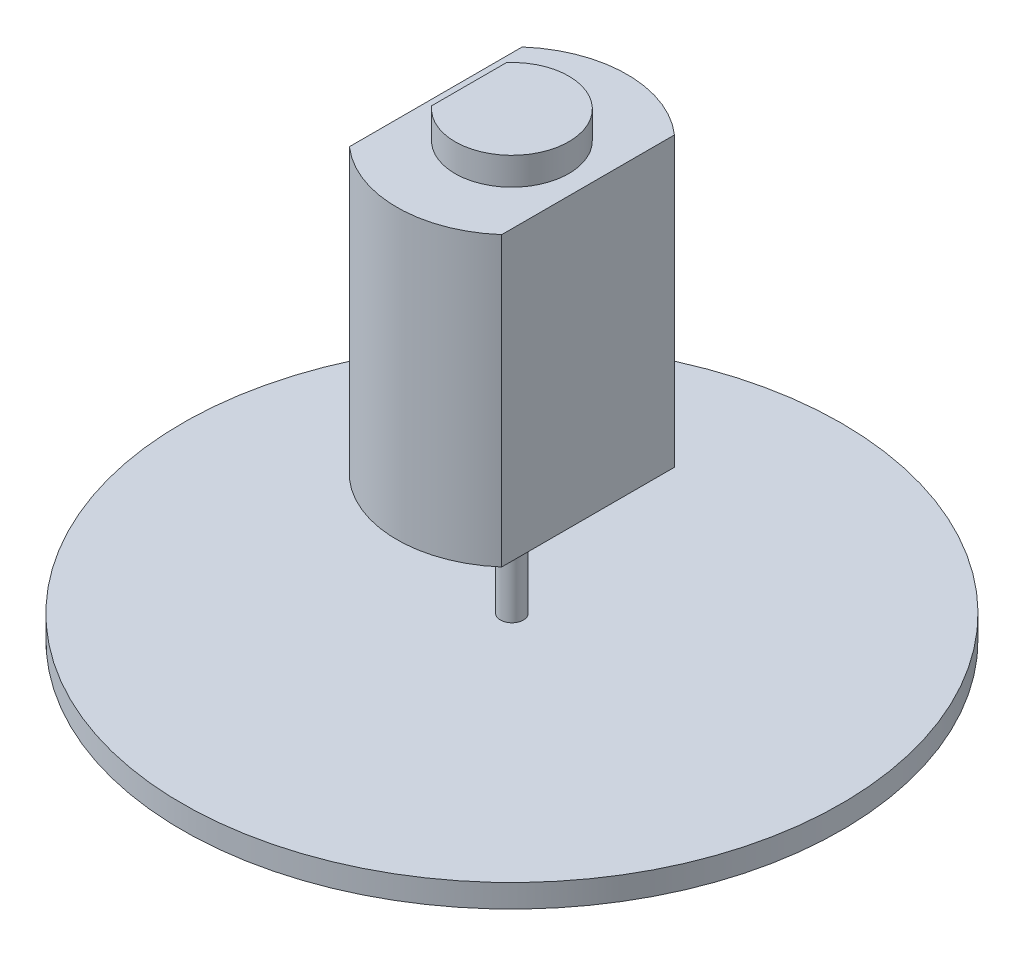
ISO-10303-21;
HEADER;
FILE_DESCRIPTION(('STEP AP214'),'2;1');
FILE_NAME('part.step','',(''),(''),'','','');
FILE_SCHEMA(('AUTOMOTIVE_DESIGN { 1 0 10303 214 1 1 1 1 }'));
ENDSEC;
DATA;
#1=APPLICATION_CONTEXT('core data for automotive mechanical design processes');
#2=APPLICATION_PROTOCOL_DEFINITION('international standard','automotive_design',2000,#1);
#3=PRODUCT_CONTEXT('',#1,'mechanical');
#4=PRODUCT('Part','Part','',(#3));
#5=PRODUCT_RELATED_PRODUCT_CATEGORY('part','',(#4));
#6=PRODUCT_DEFINITION_FORMATION('','',#4);
#7=PRODUCT_DEFINITION_CONTEXT('part definition',#1,'design');
#8=PRODUCT_DEFINITION('design','',#6,#7);
#9=PRODUCT_DEFINITION_SHAPE('','',#8);
#10=(LENGTH_UNIT() NAMED_UNIT(*) SI_UNIT(.MILLI.,.METRE.));
#11=(NAMED_UNIT(*) PLANE_ANGLE_UNIT() SI_UNIT($,.RADIAN.));
#12=(NAMED_UNIT(*) SI_UNIT($,.STERADIAN.) SOLID_ANGLE_UNIT());
#13=UNCERTAINTY_MEASURE_WITH_UNIT(LENGTH_MEASURE(1.E-05),#10,'distance_accuracy_value','');
#14=(GEOMETRIC_REPRESENTATION_CONTEXT(3) GLOBAL_UNCERTAINTY_ASSIGNED_CONTEXT((#13)) GLOBAL_UNIT_ASSIGNED_CONTEXT((#10,
#11,#12)) REPRESENTATION_CONTEXT('',''));
#15=CARTESIAN_POINT('',(0.,0.,0.));
#16=DIRECTION('',(0.,0.,1.));
#17=DIRECTION('',(1.,0.,0.));
#18=AXIS2_PLACEMENT_3D('',#15,#16,#17);
#19=CARTESIAN_POINT('',(0.,25.,0.));
#20=DIRECTION('',(0.,-1.,0.));
#21=DIRECTION('',(0.,0.,-1.));
#22=AXIS2_PLACEMENT_3D('',#19,#20,#21);
#23=CYLINDRICAL_SURFACE('',#22,10.);
#24=CARTESIAN_POINT('',(0.,0.,0.));
#25=DIRECTION('',(0.,1.,0.));
#26=DIRECTION('',(0.,0.,1.));
#27=AXIS2_PLACEMENT_3D('',#24,#25,#26);
#28=CIRCLE('',#27,10.);
#29=CARTESIAN_POINT('',(6.61437827766148,0.,-7.5));
#30=VERTEX_POINT('',#29);
#31=CARTESIAN_POINT('',(-6.61437827766148,0.,-7.5));
#32=VERTEX_POINT('',#31);
#33=EDGE_CURVE('E129',#30,#32,#28,.T.);
#34=ORIENTED_EDGE('',*,*,#33,.T.);
#35=DIRECTION('',(0.,-1.,0.));
#36=VECTOR('',#35,1.);
#37=CARTESIAN_POINT('',(-6.61437827766148,25.,-7.5));
#38=LINE('',#37,#36);
#39=CARTESIAN_POINT('',(-6.61437827766148,25.,-7.5));
#40=VERTEX_POINT('',#39);
#41=EDGE_CURVE('E48',#40,#32,#38,.T.);
#42=ORIENTED_EDGE('',*,*,#41,.F.);
#43=CARTESIAN_POINT('',(0.,25.,0.));
#44=DIRECTION('',(0.,1.,0.));
#45=DIRECTION('',(0.,0.,1.));
#46=AXIS2_PLACEMENT_3D('',#43,#44,#45);
#47=CIRCLE('',#46,10.);
#48=CARTESIAN_POINT('',(6.61437827766148,25.,-7.5));
#49=VERTEX_POINT('',#48);
#50=EDGE_CURVE('E139',#49,#40,#47,.T.);
#51=ORIENTED_EDGE('',*,*,#50,.F.);
#52=DIRECTION('',(0.,-1.,0.));
#53=VECTOR('',#52,1.);
#54=CARTESIAN_POINT('',(6.61437827766148,25.,-7.5));
#55=LINE('',#54,#53);
#56=EDGE_CURVE('E148',#49,#30,#55,.T.);
#57=ORIENTED_EDGE('',*,*,#56,.T.);
#58=EDGE_LOOP('',(#34,#42,#51,#57));
#59=FACE_BOUND('',#58,.T.);
#60=ADVANCED_FACE('F45',(#59),#23,.T.);
#61=CARTESIAN_POINT('',(-6.61437827766148,25.,7.5));
#62=DIRECTION('',(1.,0.,0.));
#63=DIRECTION('',(0.,0.,-1.));
#64=AXIS2_PLACEMENT_3D('',#61,#62,#63);
#65=PLANE('',#64);
#66=DIRECTION('',(0.,0.,1.));
#67=VECTOR('',#66,1.);
#68=CARTESIAN_POINT('',(-6.61437827766148,0.,7.5));
#69=LINE('',#68,#67);
#70=CARTESIAN_POINT('',(-6.61437827766148,0.,7.5));
#71=VERTEX_POINT('',#70);
#72=EDGE_CURVE('E134',#32,#71,#69,.T.);
#73=ORIENTED_EDGE('',*,*,#72,.T.);
#74=DIRECTION('',(0.,-1.,0.));
#75=VECTOR('',#74,1.);
#76=CARTESIAN_POINT('',(-6.61437827766148,25.,7.5));
#77=LINE('',#76,#75);
#78=CARTESIAN_POINT('',(-6.61437827766148,25.,7.5));
#79=VERTEX_POINT('',#78);
#80=EDGE_CURVE('E161',#79,#71,#77,.T.);
#81=ORIENTED_EDGE('',*,*,#80,.F.);
#82=DIRECTION('',(0.,0.,1.));
#83=VECTOR('',#82,1.);
#84=CARTESIAN_POINT('',(-6.61437827766148,25.,7.5));
#85=LINE('',#84,#83);
#86=EDGE_CURVE('E99',#40,#79,#85,.T.);
#87=ORIENTED_EDGE('',*,*,#86,.F.);
#88=ORIENTED_EDGE('',*,*,#41,.T.);
#89=EDGE_LOOP('',(#73,#81,#87,#88));
#90=FACE_BOUND('',#89,.T.);
#91=ADVANCED_FACE('F209',(#90),#65,.F.);
#92=CARTESIAN_POINT('',(0.,25.,0.));
#93=DIRECTION('',(0.,-1.,0.));
#94=DIRECTION('',(0.,0.,-1.));
#95=AXIS2_PLACEMENT_3D('',#92,#93,#94);
#96=CYLINDRICAL_SURFACE('',#95,10.);
#97=CARTESIAN_POINT('',(0.,0.,0.));
#98=DIRECTION('',(0.,1.,0.));
#99=DIRECTION('',(0.,0.,1.));
#100=AXIS2_PLACEMENT_3D('',#97,#98,#99);
#101=CIRCLE('',#100,10.);
#102=CARTESIAN_POINT('',(6.61437827766148,0.,7.5));
#103=VERTEX_POINT('',#102);
#104=EDGE_CURVE('E152',#71,#103,#101,.T.);
#105=ORIENTED_EDGE('',*,*,#104,.T.);
#106=DIRECTION('',(0.,-1.,0.));
#107=VECTOR('',#106,1.);
#108=CARTESIAN_POINT('',(6.61437827766148,25.,7.5));
#109=LINE('',#108,#107);
#110=CARTESIAN_POINT('',(6.61437827766148,25.,7.5));
#111=VERTEX_POINT('',#110);
#112=EDGE_CURVE('E159',#111,#103,#109,.T.);
#113=ORIENTED_EDGE('',*,*,#112,.F.);
#114=CARTESIAN_POINT('',(0.,25.,0.));
#115=DIRECTION('',(0.,1.,0.));
#116=DIRECTION('',(0.,0.,1.));
#117=AXIS2_PLACEMENT_3D('',#114,#115,#116);
#118=CIRCLE('',#117,10.);
#119=EDGE_CURVE('E144',#79,#111,#118,.T.);
#120=ORIENTED_EDGE('',*,*,#119,.F.);
#121=ORIENTED_EDGE('',*,*,#80,.T.);
#122=EDGE_LOOP('',(#105,#113,#120,#121));
#123=FACE_BOUND('',#122,.T.);
#124=ADVANCED_FACE('F214',(#123),#96,.T.);
#125=CARTESIAN_POINT('',(6.61437827766148,25.,7.5));
#126=DIRECTION('',(-1.,0.,0.));
#127=DIRECTION('',(0.,0.,1.));
#128=AXIS2_PLACEMENT_3D('',#125,#126,#127);
#129=PLANE('',#128);
#130=DIRECTION('',(0.,0.,-1.));
#131=VECTOR('',#130,1.);
#132=CARTESIAN_POINT('',(6.61437827766148,0.,7.5));
#133=LINE('',#132,#131);
#134=EDGE_CURVE('E91',#103,#30,#133,.T.);
#135=ORIENTED_EDGE('',*,*,#134,.T.);
#136=ORIENTED_EDGE('',*,*,#56,.F.);
#137=DIRECTION('',(0.,0.,-1.));
#138=VECTOR('',#137,1.);
#139=CARTESIAN_POINT('',(6.61437827766148,25.,7.5));
#140=LINE('',#139,#138);
#141=EDGE_CURVE('E70',#111,#49,#140,.T.);
#142=ORIENTED_EDGE('',*,*,#141,.F.);
#143=ORIENTED_EDGE('',*,*,#112,.T.);
#144=EDGE_LOOP('',(#135,#136,#142,#143));
#145=FACE_BOUND('',#144,.T.);
#146=ADVANCED_FACE('F222',(#145),#129,.F.);
#147=CARTESIAN_POINT('',(0.,25.,0.));
#148=DIRECTION('',(0.,1.,0.));
#149=DIRECTION('',(0.,0.,1.));
#150=AXIS2_PLACEMENT_3D('',#147,#148,#149);
#151=PLANE('',#150);
#152=CARTESIAN_POINT('',(0.,25.,0.));
#153=DIRECTION('',(0.,1.,0.));
#154=DIRECTION('',(0.,0.,1.));
#155=AXIS2_PLACEMENT_3D('',#152,#153,#154);
#156=CIRCLE('',#155,4.94);
#157=CARTESIAN_POINT('',(-3.72036288552609,25.,3.25));
#158=VERTEX_POINT('',#157);
#159=CARTESIAN_POINT('',(-3.72036288552609,25.,-3.25));
#160=VERTEX_POINT('',#159);
#161=EDGE_CURVE('E127',#158,#160,#156,.T.);
#162=ORIENTED_EDGE('',*,*,#161,.F.);
#163=DIRECTION('',(0.,0.,1.));
#164=VECTOR('',#163,1.);
#165=CARTESIAN_POINT('',(-3.72036288552609,25.,-3.25));
#166=LINE('',#165,#164);
#167=EDGE_CURVE('E61',#160,#158,#166,.T.);
#168=ORIENTED_EDGE('',*,*,#167,.F.);
#169=EDGE_LOOP('',(#162,#168));
#170=FACE_BOUND('',#169,.T.);
#171=ORIENTED_EDGE('',*,*,#50,.T.);
#172=ORIENTED_EDGE('',*,*,#86,.T.);
#173=ORIENTED_EDGE('',*,*,#119,.T.);
#174=ORIENTED_EDGE('',*,*,#141,.T.);
#175=EDGE_LOOP('',(#171,#172,#173,#174));
#176=FACE_BOUND('',#175,.T.);
#177=ADVANCED_FACE('F220',(#170,#176),#151,.T.);
#178=CARTESIAN_POINT('',(0.,0.,0.));
#179=DIRECTION('',(0.,1.,0.));
#180=DIRECTION('',(0.,0.,1.));
#181=AXIS2_PLACEMENT_3D('',#178,#179,#180);
#182=PLANE('',#181);
#183=CARTESIAN_POINT('',(0.,0.,0.));
#184=DIRECTION('',(0.,-1.,0.));
#185=DIRECTION('',(0.,0.,-1.));
#186=AXIS2_PLACEMENT_3D('',#183,#184,#185);
#187=CIRCLE('',#186,3.);
#188=CARTESIAN_POINT('',(0.,0.,-3.));
#189=VERTEX_POINT('',#188);
#190=EDGE_CURVE('E54',#189,#189,#187,.T.);
#191=ORIENTED_EDGE('',*,*,#190,.F.);
#192=EDGE_LOOP('',(#191));
#193=FACE_BOUND('',#192,.T.);
#194=ORIENTED_EDGE('',*,*,#33,.F.);
#195=ORIENTED_EDGE('',*,*,#134,.F.);
#196=ORIENTED_EDGE('',*,*,#104,.F.);
#197=ORIENTED_EDGE('',*,*,#72,.F.);
#198=EDGE_LOOP('',(#194,#195,#196,#197));
#199=FACE_BOUND('',#198,.T.);
#200=ADVANCED_FACE('F218',(#193,#199),#182,.F.);
#201=CARTESIAN_POINT('',(0.,27.4,0.));
#202=DIRECTION('',(0.,-1.,0.));
#203=DIRECTION('',(0.,0.,-1.));
#204=AXIS2_PLACEMENT_3D('',#201,#202,#203);
#205=CYLINDRICAL_SURFACE('',#204,4.94);
#206=ORIENTED_EDGE('',*,*,#161,.T.);
#207=DIRECTION('',(0.,-1.,0.));
#208=VECTOR('',#207,1.);
#209=CARTESIAN_POINT('',(-3.72036288552609,27.4,-3.25));
#210=LINE('',#209,#208);
#211=CARTESIAN_POINT('',(-3.72036288552609,27.4,-3.25));
#212=VERTEX_POINT('',#211);
#213=EDGE_CURVE('E113',#212,#160,#210,.T.);
#214=ORIENTED_EDGE('',*,*,#213,.F.);
#215=CARTESIAN_POINT('',(0.,27.4,0.));
#216=DIRECTION('',(0.,1.,0.));
#217=DIRECTION('',(0.,0.,1.));
#218=AXIS2_PLACEMENT_3D('',#215,#216,#217);
#219=CIRCLE('',#218,4.94);
#220=CARTESIAN_POINT('',(-3.72036288552609,27.4,3.25));
#221=VERTEX_POINT('',#220);
#222=EDGE_CURVE('E120',#221,#212,#219,.T.);
#223=ORIENTED_EDGE('',*,*,#222,.F.);
#224=DIRECTION('',(0.,-1.,0.));
#225=VECTOR('',#224,1.);
#226=CARTESIAN_POINT('',(-3.72036288552609,27.4,3.25));
#227=LINE('',#226,#225);
#228=EDGE_CURVE('E116',#221,#158,#227,.T.);
#229=ORIENTED_EDGE('',*,*,#228,.T.);
#230=EDGE_LOOP('',(#206,#214,#223,#229));
#231=FACE_BOUND('',#230,.T.);
#232=ADVANCED_FACE('F126',(#231),#205,.T.);
#233=CARTESIAN_POINT('',(-3.72036288552609,27.4,-3.25));
#234=DIRECTION('',(1.,0.,0.));
#235=DIRECTION('',(0.,0.,-1.));
#236=AXIS2_PLACEMENT_3D('',#233,#234,#235);
#237=PLANE('',#236);
#238=ORIENTED_EDGE('',*,*,#167,.T.);
#239=ORIENTED_EDGE('',*,*,#228,.F.);
#240=DIRECTION('',(0.,0.,1.));
#241=VECTOR('',#240,1.);
#242=CARTESIAN_POINT('',(-3.72036288552609,27.4,-3.25));
#243=LINE('',#242,#241);
#244=EDGE_CURVE('E109',#212,#221,#243,.T.);
#245=ORIENTED_EDGE('',*,*,#244,.F.);
#246=ORIENTED_EDGE('',*,*,#213,.T.);
#247=EDGE_LOOP('',(#238,#239,#245,#246));
#248=FACE_BOUND('',#247,.T.);
#249=ADVANCED_FACE('F111',(#248),#237,.F.);
#250=CARTESIAN_POINT('',(0.,27.4,0.));
#251=DIRECTION('',(0.,1.,0.));
#252=DIRECTION('',(0.,0.,1.));
#253=AXIS2_PLACEMENT_3D('',#250,#251,#252);
#254=PLANE('',#253);
#255=ORIENTED_EDGE('',*,*,#222,.T.);
#256=ORIENTED_EDGE('',*,*,#244,.T.);
#257=EDGE_LOOP('',(#255,#256));
#258=FACE_BOUND('',#257,.T.);
#259=ADVANCED_FACE('F122',(#258),#254,.T.);
#260=CARTESIAN_POINT('',(0.,-2.3,0.));
#261=DIRECTION('',(0.,1.,0.));
#262=DIRECTION('',(0.,0.,1.));
#263=AXIS2_PLACEMENT_3D('',#260,#261,#262);
#264=CYLINDRICAL_SURFACE('',#263,3.);
#265=CARTESIAN_POINT('',(0.,-2.3,0.));
#266=DIRECTION('',(0.,-1.,0.));
#267=DIRECTION('',(0.,0.,-1.));
#268=AXIS2_PLACEMENT_3D('',#265,#266,#267);
#269=CIRCLE('',#268,3.);
#270=CARTESIAN_POINT('',(0.,-2.3,-3.));
#271=VERTEX_POINT('',#270);
#272=EDGE_CURVE('E175',#271,#271,#269,.T.);
#273=ORIENTED_EDGE('',*,*,#272,.F.);
#274=EDGE_LOOP('',(#273));
#275=FACE_BOUND('',#274,.T.);
#276=ORIENTED_EDGE('',*,*,#190,.T.);
#277=EDGE_LOOP('',(#276));
#278=FACE_BOUND('',#277,.T.);
#279=ADVANCED_FACE('F279',(#275,#278),#264,.T.);
#280=CARTESIAN_POINT('',(0.,-2.3,0.));
#281=DIRECTION('',(0.,-1.,0.));
#282=DIRECTION('',(0.,0.,-1.));
#283=AXIS2_PLACEMENT_3D('',#280,#281,#282);
#284=PLANE('',#283);
#285=CARTESIAN_POINT('',(0.,-2.3,0.));
#286=DIRECTION('',(0.,-1.,0.));
#287=DIRECTION('',(0.,0.,-1.));
#288=AXIS2_PLACEMENT_3D('',#285,#286,#287);
#289=CIRCLE('',#288,1.);
#290=CARTESIAN_POINT('',(0.,-2.3,-1.));
#291=VERTEX_POINT('',#290);
#292=EDGE_CURVE('E11',#291,#291,#289,.T.);
#293=ORIENTED_EDGE('',*,*,#292,.F.);
#294=EDGE_LOOP('',(#293));
#295=FACE_BOUND('',#294,.T.);
#296=ORIENTED_EDGE('',*,*,#272,.T.);
#297=EDGE_LOOP('',(#296));
#298=FACE_BOUND('',#297,.T.);
#299=ADVANCED_FACE('F287',(#295,#298),#284,.T.);
#300=CARTESIAN_POINT('',(0.,-10.55,0.));
#301=DIRECTION('',(0.,1.,0.));
#302=DIRECTION('',(0.,0.,1.));
#303=AXIS2_PLACEMENT_3D('',#300,#301,#302);
#304=CYLINDRICAL_SURFACE('',#303,1.);
#305=CARTESIAN_POINT('',(0.,-10.55,0.));
#306=DIRECTION('',(0.,-1.,0.));
#307=DIRECTION('',(0.,0.,-1.));
#308=AXIS2_PLACEMENT_3D('',#305,#306,#307);
#309=CIRCLE('',#308,1.);
#310=CARTESIAN_POINT('',(0.,-10.55,-1.));
#311=VERTEX_POINT('',#310);
#312=EDGE_CURVE('E182',#311,#311,#309,.T.);
#313=ORIENTED_EDGE('',*,*,#312,.F.);
#314=EDGE_LOOP('',(#313));
#315=FACE_BOUND('',#314,.T.);
#316=ORIENTED_EDGE('',*,*,#292,.T.);
#317=EDGE_LOOP('',(#316));
#318=FACE_BOUND('',#317,.T.);
#319=ADVANCED_FACE('F297',(#315,#318),#304,.T.);
#320=CARTESIAN_POINT('',(0.,-12.55,0.));
#321=DIRECTION('',(0.,1.,0.));
#322=DIRECTION('',(0.,0.,1.));
#323=AXIS2_PLACEMENT_3D('',#320,#321,#322);
#324=CYLINDRICAL_SURFACE('',#323,28.625);
#325=CARTESIAN_POINT('',(0.,-12.55,0.));
#326=DIRECTION('',(0.,-1.,0.));
#327=DIRECTION('',(0.,0.,-1.));
#328=AXIS2_PLACEMENT_3D('',#325,#326,#327);
#329=CIRCLE('',#328,28.625);
#330=CARTESIAN_POINT('',(0.,-12.55,-28.625));
#331=VERTEX_POINT('',#330);
#332=EDGE_CURVE('E185',#331,#331,#329,.T.);
#333=ORIENTED_EDGE('',*,*,#332,.F.);
#334=EDGE_LOOP('',(#333));
#335=FACE_BOUND('',#334,.T.);
#336=CARTESIAN_POINT('',(0.,-10.55,0.));
#337=DIRECTION('',(0.,-1.,0.));
#338=DIRECTION('',(0.,0.,-1.));
#339=AXIS2_PLACEMENT_3D('',#336,#337,#338);
#340=CIRCLE('',#339,28.625);
#341=CARTESIAN_POINT('',(0.,-10.55,-28.625));
#342=VERTEX_POINT('',#341);
#343=EDGE_CURVE('E189',#342,#342,#340,.T.);
#344=ORIENTED_EDGE('',*,*,#343,.T.);
#345=EDGE_LOOP('',(#344));
#346=FACE_BOUND('',#345,.T.);
#347=ADVANCED_FACE('F195',(#335,#346),#324,.T.);
#348=CARTESIAN_POINT('',(0.,-12.55,0.));
#349=DIRECTION('',(0.,-1.,0.));
#350=DIRECTION('',(0.,0.,-1.));
#351=AXIS2_PLACEMENT_3D('',#348,#349,#350);
#352=PLANE('',#351);
#353=ORIENTED_EDGE('',*,*,#332,.T.);
#354=EDGE_LOOP('',(#353));
#355=FACE_BOUND('',#354,.T.);
#356=ADVANCED_FACE('F199',(#355),#352,.T.);
#357=CARTESIAN_POINT('',(0.,-10.55,0.));
#358=DIRECTION('',(0.,-1.,0.));
#359=DIRECTION('',(0.,0.,-1.));
#360=AXIS2_PLACEMENT_3D('',#357,#358,#359);
#361=PLANE('',#360);
#362=ORIENTED_EDGE('',*,*,#312,.T.);
#363=EDGE_LOOP('',(#362));
#364=FACE_BOUND('',#363,.T.);
#365=ORIENTED_EDGE('',*,*,#343,.F.);
#366=EDGE_LOOP('',(#365));
#367=FACE_BOUND('',#366,.T.);
#368=ADVANCED_FACE('F197',(#364,#367),#361,.F.);
#369=CLOSED_SHELL('',(#60,#91,#124,#146,#177,#200,#232,#249,#259,#279,#299,#319,#347,#356,#368));
#370=MANIFOLD_SOLID_BREP('B2',#369);
#371=ADVANCED_BREP_SHAPE_REPRESENTATION('',(#18,#370),#14);
#372=SHAPE_DEFINITION_REPRESENTATION(#9,#371);
ENDSEC;
END-ISO-10303-21;
